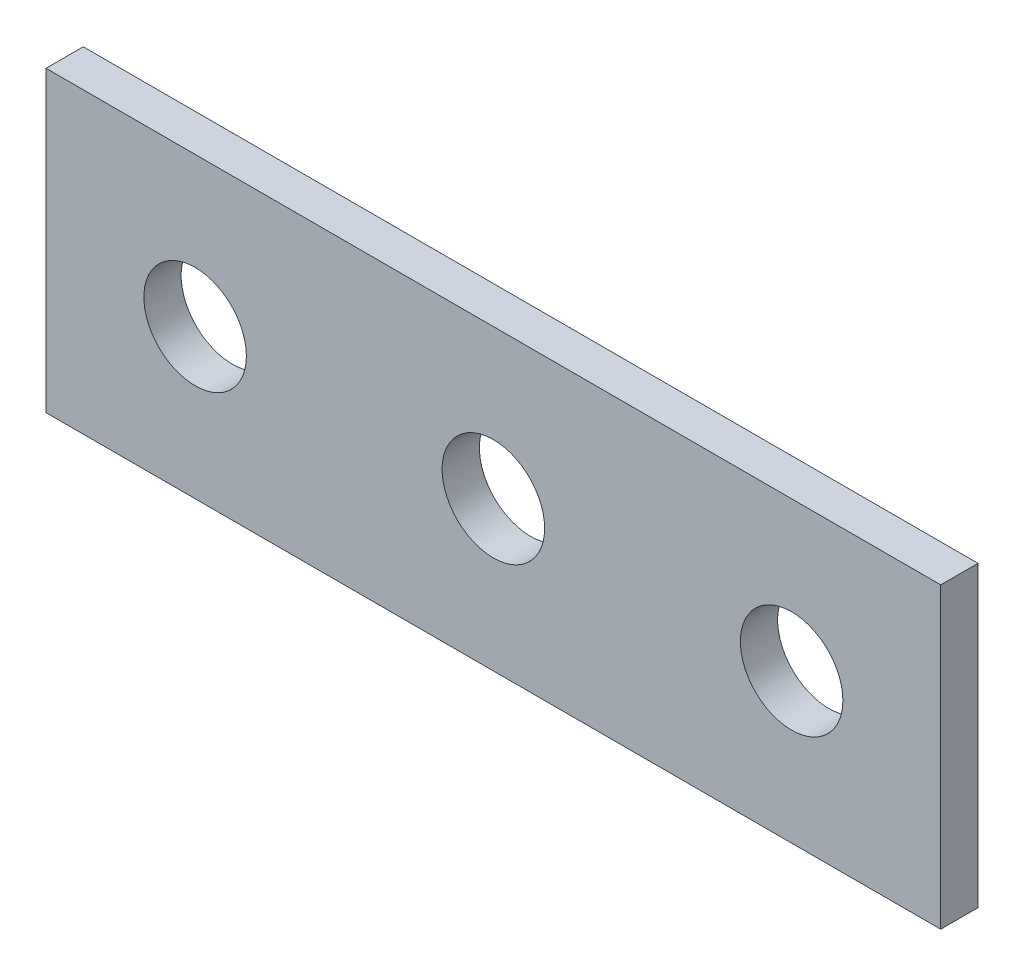
ISO-10303-21;
HEADER;
FILE_DESCRIPTION(('STEP AP214'),'2;1');
FILE_NAME('part.step','',(''),(''),'','','');
FILE_SCHEMA(('AUTOMOTIVE_DESIGN { 1 0 10303 214 1 1 1 1 }'));
ENDSEC;
DATA;
#1=APPLICATION_CONTEXT('core data for automotive mechanical design processes');
#2=APPLICATION_PROTOCOL_DEFINITION('international standard','automotive_design',2000,#1);
#3=PRODUCT_CONTEXT('',#1,'mechanical');
#4=PRODUCT('Part','Part','',(#3));
#5=PRODUCT_RELATED_PRODUCT_CATEGORY('part','',(#4));
#6=PRODUCT_DEFINITION_FORMATION('','',#4);
#7=PRODUCT_DEFINITION_CONTEXT('part definition',#1,'design');
#8=PRODUCT_DEFINITION('design','',#6,#7);
#9=PRODUCT_DEFINITION_SHAPE('','',#8);
#10=(LENGTH_UNIT() NAMED_UNIT(*) SI_UNIT(.MILLI.,.METRE.));
#11=(NAMED_UNIT(*) PLANE_ANGLE_UNIT() SI_UNIT($,.RADIAN.));
#12=(NAMED_UNIT(*) SI_UNIT($,.STERADIAN.) SOLID_ANGLE_UNIT());
#13=UNCERTAINTY_MEASURE_WITH_UNIT(LENGTH_MEASURE(1.E-05),#10,'distance_accuracy_value','');
#14=(GEOMETRIC_REPRESENTATION_CONTEXT(3) GLOBAL_UNCERTAINTY_ASSIGNED_CONTEXT((#13)) GLOBAL_UNIT_ASSIGNED_CONTEXT((#10,
#11,#12)) REPRESENTATION_CONTEXT('',''));
#15=CARTESIAN_POINT('',(0.,0.,0.));
#16=DIRECTION('',(0.,0.,1.));
#17=DIRECTION('',(1.,0.,0.));
#18=AXIS2_PLACEMENT_3D('',#15,#16,#17);
#19=CARTESIAN_POINT('',(-76.2,25.4,6.35));
#20=DIRECTION('',(1.,0.,0.));
#21=DIRECTION('',(0.,0.,-1.));
#22=AXIS2_PLACEMENT_3D('',#19,#20,#21);
#23=PLANE('',#22);
#24=DIRECTION('',(0.,-1.,0.));
#25=VECTOR('',#24,1.);
#26=CARTESIAN_POINT('',(-76.2,25.4,0.));
#27=LINE('',#26,#25);
#28=CARTESIAN_POINT('',(-76.2,25.4,0.));
#29=VERTEX_POINT('',#28);
#30=CARTESIAN_POINT('',(-76.2,-25.4,0.));
#31=VERTEX_POINT('',#30);
#32=EDGE_CURVE('E95',#29,#31,#27,.T.);
#33=ORIENTED_EDGE('',*,*,#32,.T.);
#34=DIRECTION('',(0.,0.,-1.));
#35=VECTOR('',#34,1.);
#36=CARTESIAN_POINT('',(-76.2,-25.4,6.35));
#37=LINE('',#36,#35);
#38=CARTESIAN_POINT('',(-76.2,-25.4,6.35));
#39=VERTEX_POINT('',#38);
#40=EDGE_CURVE('E11',#39,#31,#37,.T.);
#41=ORIENTED_EDGE('',*,*,#40,.F.);
#42=DIRECTION('',(0.,-1.,0.));
#43=VECTOR('',#42,1.);
#44=CARTESIAN_POINT('',(-76.2,25.4,6.35));
#45=LINE('',#44,#43);
#46=CARTESIAN_POINT('',(-76.2,25.4,6.35));
#47=VERTEX_POINT('',#46);
#48=EDGE_CURVE('E83',#47,#39,#45,.T.);
#49=ORIENTED_EDGE('',*,*,#48,.F.);
#50=DIRECTION('',(0.,0.,-1.));
#51=VECTOR('',#50,1.);
#52=CARTESIAN_POINT('',(-76.2,25.4,6.35));
#53=LINE('',#52,#51);
#54=EDGE_CURVE('E91',#47,#29,#53,.T.);
#55=ORIENTED_EDGE('',*,*,#54,.T.);
#56=EDGE_LOOP('',(#33,#41,#49,#55));
#57=FACE_BOUND('',#56,.T.);
#58=ADVANCED_FACE('F32',(#57),#23,.F.);
#59=CARTESIAN_POINT('',(-76.2,-25.4,6.35));
#60=DIRECTION('',(0.,1.,0.));
#61=DIRECTION('',(0.,0.,1.));
#62=AXIS2_PLACEMENT_3D('',#59,#60,#61);
#63=PLANE('',#62);
#64=DIRECTION('',(1.,0.,0.));
#65=VECTOR('',#64,1.);
#66=CARTESIAN_POINT('',(-76.2,-25.4,0.));
#67=LINE('',#66,#65);
#68=CARTESIAN_POINT('',(76.2,-25.4,0.));
#69=VERTEX_POINT('',#68);
#70=EDGE_CURVE('E87',#31,#69,#67,.T.);
#71=ORIENTED_EDGE('',*,*,#70,.T.);
#72=DIRECTION('',(0.,0.,-1.));
#73=VECTOR('',#72,1.);
#74=CARTESIAN_POINT('',(76.2,-25.4,6.35));
#75=LINE('',#74,#73);
#76=CARTESIAN_POINT('',(76.2,-25.4,6.35));
#77=VERTEX_POINT('',#76);
#78=EDGE_CURVE('E40',#77,#69,#75,.T.);
#79=ORIENTED_EDGE('',*,*,#78,.F.);
#80=DIRECTION('',(1.,0.,0.));
#81=VECTOR('',#80,1.);
#82=CARTESIAN_POINT('',(-76.2,-25.4,6.35));
#83=LINE('',#82,#81);
#84=EDGE_CURVE('E78',#39,#77,#83,.T.);
#85=ORIENTED_EDGE('',*,*,#84,.F.);
#86=ORIENTED_EDGE('',*,*,#40,.T.);
#87=EDGE_LOOP('',(#71,#79,#85,#86));
#88=FACE_BOUND('',#87,.T.);
#89=ADVANCED_FACE('F86',(#88),#63,.F.);
#90=CARTESIAN_POINT('',(76.2,25.4,6.35));
#91=DIRECTION('',(-1.,0.,0.));
#92=DIRECTION('',(0.,0.,1.));
#93=AXIS2_PLACEMENT_3D('',#90,#91,#92);
#94=PLANE('',#93);
#95=DIRECTION('',(0.,1.,0.));
#96=VECTOR('',#95,1.);
#97=CARTESIAN_POINT('',(76.2,25.4,0.));
#98=LINE('',#97,#96);
#99=CARTESIAN_POINT('',(76.2,25.4,0.));
#100=VERTEX_POINT('',#99);
#101=EDGE_CURVE('E65',#69,#100,#98,.T.);
#102=ORIENTED_EDGE('',*,*,#101,.T.);
#103=DIRECTION('',(0.,0.,-1.));
#104=VECTOR('',#103,1.);
#105=CARTESIAN_POINT('',(76.2,25.4,6.35));
#106=LINE('',#105,#104);
#107=CARTESIAN_POINT('',(76.2,25.4,6.35));
#108=VERTEX_POINT('',#107);
#109=EDGE_CURVE('E88',#108,#100,#106,.T.);
#110=ORIENTED_EDGE('',*,*,#109,.F.);
#111=DIRECTION('',(0.,1.,0.));
#112=VECTOR('',#111,1.);
#113=CARTESIAN_POINT('',(76.2,25.4,6.35));
#114=LINE('',#113,#112);
#115=EDGE_CURVE('E81',#77,#108,#114,.T.);
#116=ORIENTED_EDGE('',*,*,#115,.F.);
#117=ORIENTED_EDGE('',*,*,#78,.T.);
#118=EDGE_LOOP('',(#102,#110,#116,#117));
#119=FACE_BOUND('',#118,.T.);
#120=ADVANCED_FACE('F89',(#119),#94,.F.);
#121=CARTESIAN_POINT('',(-76.2,25.4,6.35));
#122=DIRECTION('',(0.,-1.,0.));
#123=DIRECTION('',(0.,0.,-1.));
#124=AXIS2_PLACEMENT_3D('',#121,#122,#123);
#125=PLANE('',#124);
#126=DIRECTION('',(-1.,0.,0.));
#127=VECTOR('',#126,1.);
#128=CARTESIAN_POINT('',(-76.2,25.4,0.));
#129=LINE('',#128,#127);
#130=EDGE_CURVE('E71',#100,#29,#129,.T.);
#131=ORIENTED_EDGE('',*,*,#130,.T.);
#132=ORIENTED_EDGE('',*,*,#54,.F.);
#133=DIRECTION('',(-1.,0.,0.));
#134=VECTOR('',#133,1.);
#135=CARTESIAN_POINT('',(-76.2,25.4,6.35));
#136=LINE('',#135,#134);
#137=EDGE_CURVE('E48',#108,#47,#136,.T.);
#138=ORIENTED_EDGE('',*,*,#137,.F.);
#139=ORIENTED_EDGE('',*,*,#109,.T.);
#140=EDGE_LOOP('',(#131,#132,#138,#139));
#141=FACE_BOUND('',#140,.T.);
#142=ADVANCED_FACE('F103',(#141),#125,.F.);
#143=CARTESIAN_POINT('',(0.,0.,6.35));
#144=DIRECTION('',(0.,0.,1.));
#145=DIRECTION('',(1.,0.,0.));
#146=AXIS2_PLACEMENT_3D('',#143,#144,#145);
#147=PLANE('',#146);
#148=CARTESIAN_POINT('',(0.,0.,6.35));
#149=DIRECTION('',(0.,0.,1.));
#150=DIRECTION('',(1.,0.,0.));
#151=AXIS2_PLACEMENT_3D('',#148,#149,#150);
#152=CIRCLE('',#151,8.73125);
#153=CARTESIAN_POINT('',(8.73125,0.,6.35));
#154=VERTEX_POINT('',#153);
#155=EDGE_CURVE('E123',#154,#154,#152,.T.);
#156=ORIENTED_EDGE('',*,*,#155,.F.);
#157=EDGE_LOOP('',(#156));
#158=FACE_BOUND('',#157,.T.);
#159=CARTESIAN_POINT('',(50.8,0.,6.35));
#160=DIRECTION('',(0.,0.,1.));
#161=DIRECTION('',(1.,0.,0.));
#162=AXIS2_PLACEMENT_3D('',#159,#160,#161);
#163=CIRCLE('',#162,8.73125);
#164=CARTESIAN_POINT('',(59.53125,0.,6.35));
#165=VERTEX_POINT('',#164);
#166=EDGE_CURVE('E117',#165,#165,#163,.T.);
#167=ORIENTED_EDGE('',*,*,#166,.F.);
#168=EDGE_LOOP('',(#167));
#169=FACE_BOUND('',#168,.T.);
#170=CARTESIAN_POINT('',(-50.8,0.,6.35));
#171=DIRECTION('',(0.,0.,1.));
#172=DIRECTION('',(1.,0.,0.));
#173=AXIS2_PLACEMENT_3D('',#170,#171,#172);
#174=CIRCLE('',#173,8.73125);
#175=CARTESIAN_POINT('',(-42.06875,0.,6.35));
#176=VERTEX_POINT('',#175);
#177=EDGE_CURVE('E111',#176,#176,#174,.T.);
#178=ORIENTED_EDGE('',*,*,#177,.F.);
#179=EDGE_LOOP('',(#178));
#180=FACE_BOUND('',#179,.T.);
#181=ORIENTED_EDGE('',*,*,#48,.T.);
#182=ORIENTED_EDGE('',*,*,#84,.T.);
#183=ORIENTED_EDGE('',*,*,#115,.T.);
#184=ORIENTED_EDGE('',*,*,#137,.T.);
#185=EDGE_LOOP('',(#181,#182,#183,#184));
#186=FACE_BOUND('',#185,.T.);
#187=ADVANCED_FACE('F79',(#158,#169,#180,#186),#147,.T.);
#188=CARTESIAN_POINT('',(0.,0.,0.));
#189=DIRECTION('',(0.,0.,1.));
#190=DIRECTION('',(1.,0.,0.));
#191=AXIS2_PLACEMENT_3D('',#188,#189,#190);
#192=PLANE('',#191);
#193=CARTESIAN_POINT('',(0.,0.,0.));
#194=DIRECTION('',(0.,0.,1.));
#195=DIRECTION('',(1.,0.,0.));
#196=AXIS2_PLACEMENT_3D('',#193,#194,#195);
#197=CIRCLE('',#196,8.73125);
#198=CARTESIAN_POINT('',(8.73125,0.,0.));
#199=VERTEX_POINT('',#198);
#200=EDGE_CURVE('E120',#199,#199,#197,.T.);
#201=ORIENTED_EDGE('',*,*,#200,.T.);
#202=EDGE_LOOP('',(#201));
#203=FACE_BOUND('',#202,.T.);
#204=CARTESIAN_POINT('',(50.8,0.,0.));
#205=DIRECTION('',(0.,0.,1.));
#206=DIRECTION('',(1.,0.,0.));
#207=AXIS2_PLACEMENT_3D('',#204,#205,#206);
#208=CIRCLE('',#207,8.73125);
#209=CARTESIAN_POINT('',(59.53125,0.,0.));
#210=VERTEX_POINT('',#209);
#211=EDGE_CURVE('E114',#210,#210,#208,.T.);
#212=ORIENTED_EDGE('',*,*,#211,.T.);
#213=EDGE_LOOP('',(#212));
#214=FACE_BOUND('',#213,.T.);
#215=CARTESIAN_POINT('',(-50.8,0.,0.));
#216=DIRECTION('',(0.,0.,1.));
#217=DIRECTION('',(1.,0.,0.));
#218=AXIS2_PLACEMENT_3D('',#215,#216,#217);
#219=CIRCLE('',#218,8.73125);
#220=CARTESIAN_POINT('',(-42.06875,0.,0.));
#221=VERTEX_POINT('',#220);
#222=EDGE_CURVE('E98',#221,#221,#219,.T.);
#223=ORIENTED_EDGE('',*,*,#222,.T.);
#224=EDGE_LOOP('',(#223));
#225=FACE_BOUND('',#224,.T.);
#226=ORIENTED_EDGE('',*,*,#32,.F.);
#227=ORIENTED_EDGE('',*,*,#130,.F.);
#228=ORIENTED_EDGE('',*,*,#101,.F.);
#229=ORIENTED_EDGE('',*,*,#70,.F.);
#230=EDGE_LOOP('',(#226,#227,#228,#229));
#231=FACE_BOUND('',#230,.T.);
#232=ADVANCED_FACE('F106',(#203,#214,#225,#231),#192,.F.);
#233=CARTESIAN_POINT('',(-50.8,0.,6.35));
#234=DIRECTION('',(0.,0.,1.));
#235=DIRECTION('',(1.,0.,0.));
#236=AXIS2_PLACEMENT_3D('',#233,#234,#235);
#237=CYLINDRICAL_SURFACE('',#236,8.73125);
#238=ORIENTED_EDGE('',*,*,#222,.F.);
#239=EDGE_LOOP('',(#238));
#240=FACE_BOUND('',#239,.T.);
#241=ORIENTED_EDGE('',*,*,#177,.T.);
#242=EDGE_LOOP('',(#241));
#243=FACE_BOUND('',#242,.T.);
#244=ADVANCED_FACE('F136',(#240,#243),#237,.F.);
#245=CARTESIAN_POINT('',(50.8,0.,6.35));
#246=DIRECTION('',(0.,0.,1.));
#247=DIRECTION('',(1.,0.,0.));
#248=AXIS2_PLACEMENT_3D('',#245,#246,#247);
#249=CYLINDRICAL_SURFACE('',#248,8.73125);
#250=ORIENTED_EDGE('',*,*,#211,.F.);
#251=EDGE_LOOP('',(#250));
#252=FACE_BOUND('',#251,.T.);
#253=ORIENTED_EDGE('',*,*,#166,.T.);
#254=EDGE_LOOP('',(#253));
#255=FACE_BOUND('',#254,.T.);
#256=ADVANCED_FACE('F138',(#252,#255),#249,.F.);
#257=CARTESIAN_POINT('',(0.,0.,6.35));
#258=DIRECTION('',(0.,0.,1.));
#259=DIRECTION('',(1.,0.,0.));
#260=AXIS2_PLACEMENT_3D('',#257,#258,#259);
#261=CYLINDRICAL_SURFACE('',#260,8.73125);
#262=ORIENTED_EDGE('',*,*,#200,.F.);
#263=EDGE_LOOP('',(#262));
#264=FACE_BOUND('',#263,.T.);
#265=ORIENTED_EDGE('',*,*,#155,.T.);
#266=EDGE_LOOP('',(#265));
#267=FACE_BOUND('',#266,.T.);
#268=ADVANCED_FACE('F127',(#264,#267),#261,.F.);
#269=CLOSED_SHELL('',(#58,#89,#120,#142,#187,#232,#244,#256,#268));
#270=MANIFOLD_SOLID_BREP('B2',#269);
#271=ADVANCED_BREP_SHAPE_REPRESENTATION('',(#18,#270),#14);
#272=SHAPE_DEFINITION_REPRESENTATION(#9,#271);
ENDSEC;
END-ISO-10303-21;
